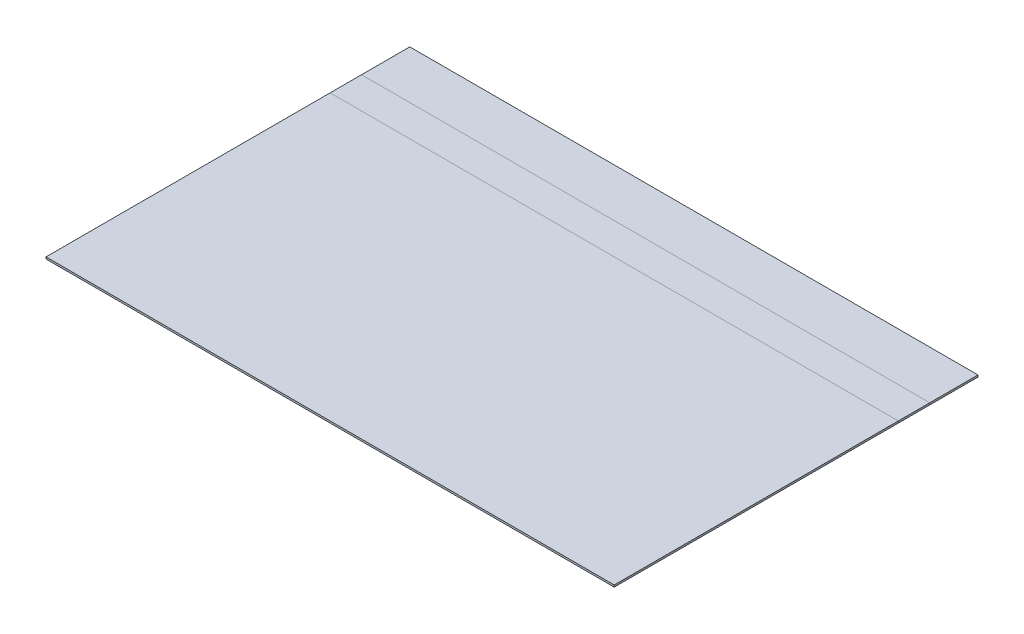
ISO-10303-21;
HEADER;
FILE_DESCRIPTION(('STEP AP214'),'2;1');
FILE_NAME('part.step','',(''),(''),'','','');
FILE_SCHEMA(('AUTOMOTIVE_DESIGN { 1 0 10303 214 1 1 1 1 }'));
ENDSEC;
DATA;
#1=APPLICATION_CONTEXT('core data for automotive mechanical design processes');
#2=APPLICATION_PROTOCOL_DEFINITION('international standard','automotive_design',2000,#1);
#3=PRODUCT_CONTEXT('',#1,'mechanical');
#4=PRODUCT('Part','Part','',(#3));
#5=PRODUCT_RELATED_PRODUCT_CATEGORY('part','',(#4));
#6=PRODUCT_DEFINITION_FORMATION('','',#4);
#7=PRODUCT_DEFINITION_CONTEXT('part definition',#1,'design');
#8=PRODUCT_DEFINITION('design','',#6,#7);
#9=PRODUCT_DEFINITION_SHAPE('','',#8);
#10=(LENGTH_UNIT() NAMED_UNIT(*) SI_UNIT(.MILLI.,.METRE.));
#11=(NAMED_UNIT(*) PLANE_ANGLE_UNIT() SI_UNIT($,.RADIAN.));
#12=(NAMED_UNIT(*) SI_UNIT($,.STERADIAN.) SOLID_ANGLE_UNIT());
#13=UNCERTAINTY_MEASURE_WITH_UNIT(LENGTH_MEASURE(1.E-05),#10,'distance_accuracy_value','');
#14=(GEOMETRIC_REPRESENTATION_CONTEXT(3) GLOBAL_UNCERTAINTY_ASSIGNED_CONTEXT((#13)) GLOBAL_UNIT_ASSIGNED_CONTEXT((#10,
#11,#12)) REPRESENTATION_CONTEXT('',''));
#15=CARTESIAN_POINT('',(0.,0.,0.));
#16=DIRECTION('',(0.,0.,1.));
#17=DIRECTION('',(1.,0.,0.));
#18=AXIS2_PLACEMENT_3D('',#15,#16,#17);
#19=CARTESIAN_POINT('',(-150.,-0.999999999991954,481.354070639259));
#20=DIRECTION('',(-1.,0.,0.));
#21=DIRECTION('',(0.,0.0174524064372768,-0.999847695156391));
#22=AXIS2_PLACEMENT_3D('',#19,#20,#21);
#23=PLANE('',#22);
#24=DIRECTION('',(0.,0.,1.));
#25=VECTOR('',#24,1.);
#26=CARTESIAN_POINT('',(-150.,-0.999999999991955,481.354070639259));
#27=LINE('',#26,#25);
#28=CARTESIAN_POINT('',(-150.,-0.999999999996132,-117.057279231433));
#29=VERTEX_POINT('',#28);
#30=CARTESIAN_POINT('',(-150.,-0.999999999995954,-91.589180007281));
#31=VERTEX_POINT('',#30);
#32=EDGE_CURVE('E187',#29,#31,#27,.T.);
#33=ORIENTED_EDGE('',*,*,#32,.T.);
#34=DIRECTION('',(0.,-1.,0.));
#35=VECTOR('',#34,1.);
#36=CARTESIAN_POINT('',(-150.,4.04710986945389E-12,-91.589180007281));
#37=LINE('',#36,#35);
#38=CARTESIAN_POINT('',(-150.,0.,-91.589180007281));
#39=VERTEX_POINT('',#38);
#40=EDGE_CURVE('E13',#39,#31,#37,.T.);
#41=ORIENTED_EDGE('',*,*,#40,.F.);
#42=DIRECTION('',(0.,0.,-1.));
#43=VECTOR('',#42,1.);
#44=CARTESIAN_POINT('',(-150.,7.52176099183544E-12,406.36549350253));
#45=LINE('',#44,#43);
#46=CARTESIAN_POINT('',(-150.,3.87016807490426E-12,-117.057279231433));
#47=VERTEX_POINT('',#46);
#48=EDGE_CURVE('E194',#47,#39,#45,.F.);
#49=ORIENTED_EDGE('',*,*,#48,.F.);
#50=DIRECTION('',(0.,1.,0.));
#51=VECTOR('',#50,1.);
#52=CARTESIAN_POINT('',(-150.,-0.999999999996131,-117.057279231433));
#53=LINE('',#52,#51);
#54=EDGE_CURVE('E90',#29,#47,#53,.T.);
#55=ORIENTED_EDGE('',*,*,#54,.F.);
#56=EDGE_LOOP('',(#33,#41,#49,#55));
#57=FACE_BOUND('',#56,.T.);
#58=ADVANCED_FACE('F59',(#57),#23,.T.);
#59=CARTESIAN_POINT('',(150.,-0.999999999996131,-117.057279231433));
#60=DIRECTION('',(1.,0.,0.));
#61=DIRECTION('',(0.,-0.0174524064372768,0.999847695156391));
#62=AXIS2_PLACEMENT_3D('',#59,#60,#61);
#63=PLANE('',#62);
#64=DIRECTION('',(0.,0.,1.));
#65=VECTOR('',#64,1.);
#66=CARTESIAN_POINT('',(150.,7.52176099183544E-12,406.36549350253));
#67=LINE('',#66,#65);
#68=CARTESIAN_POINT('',(150.,0.,-91.5891800072809));
#69=VERTEX_POINT('',#68);
#70=CARTESIAN_POINT('',(150.,3.87016807490426E-12,-117.057279231433));
#71=VERTEX_POINT('',#70);
#72=EDGE_CURVE('E97',#69,#71,#67,.F.);
#73=ORIENTED_EDGE('',*,*,#72,.F.);
#74=DIRECTION('',(0.,-1.,0.));
#75=VECTOR('',#74,1.);
#76=CARTESIAN_POINT('',(150.,-0.999999999995955,-91.589180007281));
#77=LINE('',#76,#75);
#78=CARTESIAN_POINT('',(150.,-0.999999999995954,-91.5891800072809));
#79=VERTEX_POINT('',#78);
#80=EDGE_CURVE('E200',#69,#79,#77,.T.);
#81=ORIENTED_EDGE('',*,*,#80,.T.);
#82=DIRECTION('',(0.,0.,-1.));
#83=VECTOR('',#82,1.);
#84=CARTESIAN_POINT('',(150.,-0.999999999996134,-117.057279231433));
#85=LINE('',#84,#83);
#86=CARTESIAN_POINT('',(150.,-0.999999999996134,-117.057279231433));
#87=VERTEX_POINT('',#86);
#88=EDGE_CURVE('E192',#79,#87,#85,.T.);
#89=ORIENTED_EDGE('',*,*,#88,.T.);
#90=DIRECTION('',(0.,1.,0.));
#91=VECTOR('',#90,1.);
#92=CARTESIAN_POINT('',(150.,-0.999999999996131,-117.057279231433));
#93=LINE('',#92,#91);
#94=EDGE_CURVE('E185',#87,#71,#93,.T.);
#95=ORIENTED_EDGE('',*,*,#94,.T.);
#96=EDGE_LOOP('',(#73,#81,#89,#95));
#97=FACE_BOUND('',#96,.T.);
#98=ADVANCED_FACE('F61',(#97),#63,.T.);
#99=CARTESIAN_POINT('',(0.,-0.999999999992479,406.36549350253));
#100=DIRECTION('',(0.,-1.,0.));
#101=DIRECTION('',(0.,0.,-1.));
#102=AXIS2_PLACEMENT_3D('',#99,#100,#101);
#103=PLANE('',#102);
#104=ORIENTED_EDGE('',*,*,#88,.F.);
#105=DIRECTION('',(-1.,0.,0.));
#106=VECTOR('',#105,1.);
#107=CARTESIAN_POINT('',(0.,-0.999999999995954,-91.589180007281));
#108=LINE('',#107,#106);
#109=EDGE_CURVE('E132',#79,#31,#108,.T.);
#110=ORIENTED_EDGE('',*,*,#109,.T.);
#111=ORIENTED_EDGE('',*,*,#32,.F.);
#112=DIRECTION('',(-1.,0.,0.));
#113=VECTOR('',#112,1.);
#114=CARTESIAN_POINT('',(-150.,-0.999999999996134,-117.057279231433));
#115=LINE('',#114,#113);
#116=EDGE_CURVE('E190',#87,#29,#115,.T.);
#117=ORIENTED_EDGE('',*,*,#116,.F.);
#118=EDGE_LOOP('',(#104,#110,#111,#117));
#119=FACE_BOUND('',#118,.T.);
#120=ADVANCED_FACE('F236',(#119),#103,.T.);
#121=CARTESIAN_POINT('',(0.,7.52176099183544E-12,406.36549350253));
#122=DIRECTION('',(0.,-1.,0.));
#123=DIRECTION('',(0.,0.,-1.));
#124=AXIS2_PLACEMENT_3D('',#121,#122,#123);
#125=PLANE('',#124);
#126=DIRECTION('',(-1.,0.,0.));
#127=VECTOR('',#126,1.);
#128=CARTESIAN_POINT('',(150.,4.04710986945389E-12,-91.589180007281));
#129=LINE('',#128,#127);
#130=EDGE_CURVE('E68',#69,#39,#129,.T.);
#131=ORIENTED_EDGE('',*,*,#130,.F.);
#132=ORIENTED_EDGE('',*,*,#72,.T.);
#133=DIRECTION('',(1.,0.,0.));
#134=VECTOR('',#133,1.);
#135=CARTESIAN_POINT('',(0.,3.87016807490426E-12,-117.057279231433));
#136=LINE('',#135,#134);
#137=EDGE_CURVE('E196',#71,#47,#136,.F.);
#138=ORIENTED_EDGE('',*,*,#137,.T.);
#139=ORIENTED_EDGE('',*,*,#48,.T.);
#140=EDGE_LOOP('',(#131,#132,#138,#139));
#141=FACE_BOUND('',#140,.T.);
#142=ADVANCED_FACE('F238',(#141),#125,.F.);
#143=CARTESIAN_POINT('',(-150.,-0.999999999996131,-117.057279231433));
#144=DIRECTION('',(0.,0.,-1.));
#145=DIRECTION('',(0.,1.,0.));
#146=AXIS2_PLACEMENT_3D('',#143,#144,#145);
#147=PLANE('',#146);
#148=ORIENTED_EDGE('',*,*,#137,.F.);
#149=ORIENTED_EDGE('',*,*,#94,.F.);
#150=ORIENTED_EDGE('',*,*,#116,.T.);
#151=ORIENTED_EDGE('',*,*,#54,.T.);
#152=EDGE_LOOP('',(#148,#149,#150,#151));
#153=FACE_BOUND('',#152,.T.);
#154=ADVANCED_FACE('F228',(#153),#147,.T.);
#155=CARTESIAN_POINT('',(-150.,-1.,75.));
#156=DIRECTION('',(0.,0.,1.));
#157=DIRECTION('',(1.,0.,0.));
#158=AXIS2_PLACEMENT_3D('',#155,#156,#157);
#159=PLANE('',#158);
#160=DIRECTION('',(1.,0.,0.));
#161=VECTOR('',#160,1.);
#162=CARTESIAN_POINT('',(-150.,0.,75.));
#163=LINE('',#162,#161);
#164=CARTESIAN_POINT('',(-150.,0.,75.));
#165=VERTEX_POINT('',#164);
#166=CARTESIAN_POINT('',(150.,0.,75.));
#167=VERTEX_POINT('',#166);
#168=EDGE_CURVE('E164',#165,#167,#163,.T.);
#169=ORIENTED_EDGE('',*,*,#168,.F.);
#170=DIRECTION('',(0.,1.,0.));
#171=VECTOR('',#170,1.);
#172=CARTESIAN_POINT('',(-150.,-1.,75.));
#173=LINE('',#172,#171);
#174=CARTESIAN_POINT('',(-150.,-1.,75.));
#175=VERTEX_POINT('',#174);
#176=EDGE_CURVE('E106',#175,#165,#173,.T.);
#177=ORIENTED_EDGE('',*,*,#176,.F.);
#178=DIRECTION('',(1.,0.,0.));
#179=VECTOR('',#178,1.);
#180=CARTESIAN_POINT('',(-150.,-1.,75.));
#181=LINE('',#180,#179);
#182=CARTESIAN_POINT('',(150.,-1.,75.));
#183=VERTEX_POINT('',#182);
#184=EDGE_CURVE('E151',#175,#183,#181,.T.);
#185=ORIENTED_EDGE('',*,*,#184,.T.);
#186=DIRECTION('',(0.,1.,0.));
#187=VECTOR('',#186,1.);
#188=CARTESIAN_POINT('',(150.,-1.,75.));
#189=LINE('',#188,#187);
#190=EDGE_CURVE('E179',#183,#167,#189,.T.);
#191=ORIENTED_EDGE('',*,*,#190,.T.);
#192=EDGE_LOOP('',(#169,#177,#185,#191));
#193=FACE_BOUND('',#192,.T.);
#194=ADVANCED_FACE('F212',(#193),#159,.T.);
#195=CARTESIAN_POINT('',(0.,-1.,0.));
#196=DIRECTION('',(0.,1.,0.));
#197=DIRECTION('',(0.,0.,1.));
#198=AXIS2_PLACEMENT_3D('',#195,#196,#197);
#199=PLANE('',#198);
#200=DIRECTION('',(0.,0.,-1.));
#201=VECTOR('',#200,1.);
#202=CARTESIAN_POINT('',(150.,-1.,-75.));
#203=LINE('',#202,#201);
#204=CARTESIAN_POINT('',(150.,-0.999999999995954,-75.));
#205=VERTEX_POINT('',#204);
#206=EDGE_CURVE('E176',#183,#205,#203,.T.);
#207=ORIENTED_EDGE('',*,*,#206,.F.);
#208=ORIENTED_EDGE('',*,*,#184,.F.);
#209=DIRECTION('',(0.,0.,1.));
#210=VECTOR('',#209,1.);
#211=CARTESIAN_POINT('',(-150.,-1.,-75.));
#212=LINE('',#211,#210);
#213=CARTESIAN_POINT('',(-150.,-0.999999999995954,-75.));
#214=VERTEX_POINT('',#213);
#215=EDGE_CURVE('E211',#214,#175,#212,.T.);
#216=ORIENTED_EDGE('',*,*,#215,.F.);
#217=DIRECTION('',(-1.,0.,0.));
#218=VECTOR('',#217,1.);
#219=CARTESIAN_POINT('',(-150.,-1.,-75.));
#220=LINE('',#219,#218);
#221=EDGE_CURVE('E152',#205,#214,#220,.T.);
#222=ORIENTED_EDGE('',*,*,#221,.F.);
#223=EDGE_LOOP('',(#207,#208,#216,#222));
#224=FACE_BOUND('',#223,.T.);
#225=ADVANCED_FACE('F220',(#224),#199,.F.);
#226=CARTESIAN_POINT('',(150.,-1.,-75.));
#227=DIRECTION('',(1.,0.,0.));
#228=DIRECTION('',(0.,0.,-1.));
#229=AXIS2_PLACEMENT_3D('',#226,#227,#228);
#230=PLANE('',#229);
#231=DIRECTION('',(0.,0.,-1.));
#232=VECTOR('',#231,1.);
#233=CARTESIAN_POINT('',(150.,0.,-75.));
#234=LINE('',#233,#232);
#235=CARTESIAN_POINT('',(150.,0.,-75.));
#236=VERTEX_POINT('',#235);
#237=EDGE_CURVE('E168',#167,#236,#234,.T.);
#238=ORIENTED_EDGE('',*,*,#237,.F.);
#239=ORIENTED_EDGE('',*,*,#190,.F.);
#240=ORIENTED_EDGE('',*,*,#206,.T.);
#241=DIRECTION('',(0.,1.,0.));
#242=VECTOR('',#241,1.);
#243=CARTESIAN_POINT('',(150.,-1.,-75.));
#244=LINE('',#243,#242);
#245=EDGE_CURVE('E171',#205,#236,#244,.T.);
#246=ORIENTED_EDGE('',*,*,#245,.T.);
#247=EDGE_LOOP('',(#238,#239,#240,#246));
#248=FACE_BOUND('',#247,.T.);
#249=ADVANCED_FACE('F216',(#248),#230,.T.);
#250=CARTESIAN_POINT('',(0.,0.,0.));
#251=DIRECTION('',(0.,1.,0.));
#252=DIRECTION('',(0.,0.,1.));
#253=AXIS2_PLACEMENT_3D('',#250,#251,#252);
#254=PLANE('',#253);
#255=ORIENTED_EDGE('',*,*,#237,.T.);
#256=DIRECTION('',(-1.,0.,0.));
#257=VECTOR('',#256,1.);
#258=CARTESIAN_POINT('',(-150.,0.,-75.));
#259=LINE('',#258,#257);
#260=CARTESIAN_POINT('',(-150.,0.,-75.));
#261=VERTEX_POINT('',#260);
#262=EDGE_CURVE('E157',#236,#261,#259,.T.);
#263=ORIENTED_EDGE('',*,*,#262,.T.);
#264=DIRECTION('',(0.,0.,1.));
#265=VECTOR('',#264,1.);
#266=CARTESIAN_POINT('',(-150.,0.,-75.));
#267=LINE('',#266,#265);
#268=EDGE_CURVE('E160',#261,#165,#267,.T.);
#269=ORIENTED_EDGE('',*,*,#268,.T.);
#270=ORIENTED_EDGE('',*,*,#168,.T.);
#271=EDGE_LOOP('',(#255,#263,#269,#270));
#272=FACE_BOUND('',#271,.T.);
#273=ADVANCED_FACE('F166',(#272),#254,.T.);
#274=CARTESIAN_POINT('',(-150.,-1.,-75.));
#275=DIRECTION('',(-1.,0.,0.));
#276=DIRECTION('',(0.,0.,1.));
#277=AXIS2_PLACEMENT_3D('',#274,#275,#276);
#278=PLANE('',#277);
#279=ORIENTED_EDGE('',*,*,#268,.F.);
#280=DIRECTION('',(0.,1.,0.));
#281=VECTOR('',#280,1.);
#282=CARTESIAN_POINT('',(-150.,-1.,-75.));
#283=LINE('',#282,#281);
#284=EDGE_CURVE('E145',#214,#261,#283,.T.);
#285=ORIENTED_EDGE('',*,*,#284,.F.);
#286=ORIENTED_EDGE('',*,*,#215,.T.);
#287=ORIENTED_EDGE('',*,*,#176,.T.);
#288=EDGE_LOOP('',(#279,#285,#286,#287));
#289=FACE_BOUND('',#288,.T.);
#290=ADVANCED_FACE('F161',(#289),#278,.T.);
#291=CARTESIAN_POINT('',(-150.,-0.999999999995954,-91.589180007281));
#292=DIRECTION('',(-1.,0.,0.));
#293=DIRECTION('',(0.,0.,-1.));
#294=AXIS2_PLACEMENT_3D('',#291,#292,#293);
#295=PLANE('',#294);
#296=ORIENTED_EDGE('',*,*,#284,.T.);
#297=DIRECTION('',(0.,0.,-1.));
#298=VECTOR('',#297,1.);
#299=CARTESIAN_POINT('',(-150.,0.,-83.2945900036405));
#300=LINE('',#299,#298);
#301=EDGE_CURVE('E148',#261,#39,#300,.T.);
#302=ORIENTED_EDGE('',*,*,#301,.T.);
#303=ORIENTED_EDGE('',*,*,#40,.T.);
#304=DIRECTION('',(0.,0.,-1.));
#305=VECTOR('',#304,1.);
#306=CARTESIAN_POINT('',(-150.,-0.999999999995954,-91.589180007281));
#307=LINE('',#306,#305);
#308=EDGE_CURVE('E76',#214,#31,#307,.T.);
#309=ORIENTED_EDGE('',*,*,#308,.F.);
#310=EDGE_LOOP('',(#296,#302,#303,#309));
#311=FACE_BOUND('',#310,.T.);
#312=ADVANCED_FACE('F147',(#311),#295,.T.);
#313=CARTESIAN_POINT('',(150.,-0.999999999995954,-75.));
#314=DIRECTION('',(1.,0.,0.));
#315=DIRECTION('',(0.,0.,1.));
#316=AXIS2_PLACEMENT_3D('',#313,#314,#315);
#317=PLANE('',#316);
#318=DIRECTION('',(0.,0.,-1.));
#319=VECTOR('',#318,1.);
#320=CARTESIAN_POINT('',(150.,0.,-83.2945900036405));
#321=LINE('',#320,#319);
#322=EDGE_CURVE('E126',#69,#236,#321,.F.);
#323=ORIENTED_EDGE('',*,*,#322,.T.);
#324=ORIENTED_EDGE('',*,*,#245,.F.);
#325=DIRECTION('',(0.,0.,1.));
#326=VECTOR('',#325,1.);
#327=CARTESIAN_POINT('',(150.,-0.999999999995954,-75.));
#328=LINE('',#327,#326);
#329=EDGE_CURVE('E183',#79,#205,#328,.T.);
#330=ORIENTED_EDGE('',*,*,#329,.F.);
#331=ORIENTED_EDGE('',*,*,#80,.F.);
#332=EDGE_LOOP('',(#323,#324,#330,#331));
#333=FACE_BOUND('',#332,.T.);
#334=ADVANCED_FACE('F205',(#333),#317,.T.);
#335=CARTESIAN_POINT('',(0.,-1.,-83.2945900036405));
#336=DIRECTION('',(0.,-1.,0.));
#337=DIRECTION('',(0.,0.,-1.));
#338=AXIS2_PLACEMENT_3D('',#335,#336,#337);
#339=PLANE('',#338);
#340=ORIENTED_EDGE('',*,*,#109,.F.);
#341=ORIENTED_EDGE('',*,*,#329,.T.);
#342=ORIENTED_EDGE('',*,*,#221,.T.);
#343=ORIENTED_EDGE('',*,*,#308,.T.);
#344=EDGE_LOOP('',(#340,#341,#342,#343));
#345=FACE_BOUND('',#344,.T.);
#346=ADVANCED_FACE('F218',(#345),#339,.T.);
#347=CARTESIAN_POINT('',(0.,0.,-83.2945900036405));
#348=DIRECTION('',(0.,-1.,0.));
#349=DIRECTION('',(0.,0.,-1.));
#350=AXIS2_PLACEMENT_3D('',#347,#348,#349);
#351=PLANE('',#350);
#352=ORIENTED_EDGE('',*,*,#130,.T.);
#353=ORIENTED_EDGE('',*,*,#301,.F.);
#354=ORIENTED_EDGE('',*,*,#262,.F.);
#355=ORIENTED_EDGE('',*,*,#322,.F.);
#356=EDGE_LOOP('',(#352,#353,#354,#355));
#357=FACE_BOUND('',#356,.T.);
#358=ADVANCED_FACE('F155',(#357),#351,.F.);
#359=CLOSED_SHELL('',(#58,#98,#120,#142,#154,#194,#225,#249,#273,#290,#312,#334,#346,#358));
#360=MANIFOLD_SOLID_BREP('B2',#359);
#361=ADVANCED_BREP_SHAPE_REPRESENTATION('',(#18,#360),#14);
#362=SHAPE_DEFINITION_REPRESENTATION(#9,#361);
ENDSEC;
END-ISO-10303-21;
